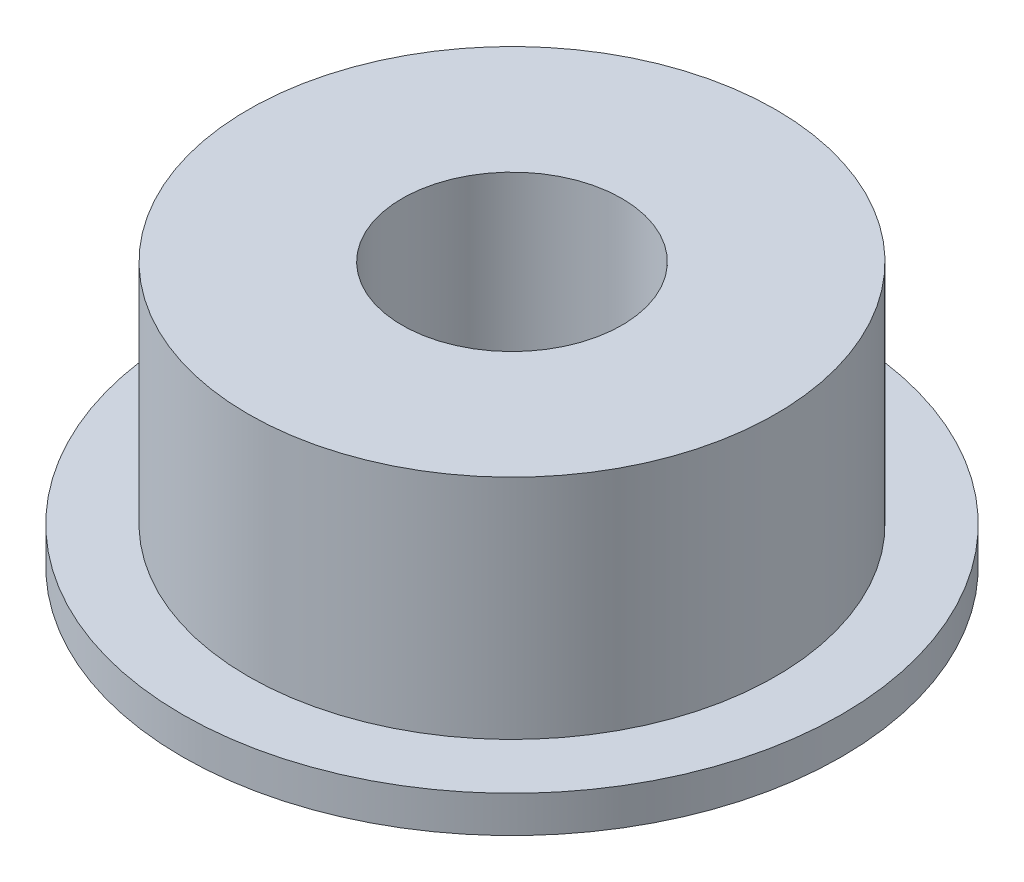
ISO-10303-21;
HEADER;
FILE_DESCRIPTION(('STEP AP214'),'2;1');
FILE_NAME('part.step','',(''),(''),'','','');
FILE_SCHEMA(('AUTOMOTIVE_DESIGN { 1 0 10303 214 1 1 1 1 }'));
ENDSEC;
DATA;
#1=APPLICATION_CONTEXT('core data for automotive mechanical design processes');
#2=APPLICATION_PROTOCOL_DEFINITION('international standard','automotive_design',2000,#1);
#3=PRODUCT_CONTEXT('',#1,'mechanical');
#4=PRODUCT('Part','Part','',(#3));
#5=PRODUCT_RELATED_PRODUCT_CATEGORY('part','',(#4));
#6=PRODUCT_DEFINITION_FORMATION('','',#4);
#7=PRODUCT_DEFINITION_CONTEXT('part definition',#1,'design');
#8=PRODUCT_DEFINITION('design','',#6,#7);
#9=PRODUCT_DEFINITION_SHAPE('','',#8);
#10=(LENGTH_UNIT() NAMED_UNIT(*) SI_UNIT(.MILLI.,.METRE.));
#11=(NAMED_UNIT(*) PLANE_ANGLE_UNIT() SI_UNIT($,.RADIAN.));
#12=(NAMED_UNIT(*) SI_UNIT($,.STERADIAN.) SOLID_ANGLE_UNIT());
#13=UNCERTAINTY_MEASURE_WITH_UNIT(LENGTH_MEASURE(1.E-05),#10,'distance_accuracy_value','');
#14=(GEOMETRIC_REPRESENTATION_CONTEXT(3) GLOBAL_UNCERTAINTY_ASSIGNED_CONTEXT((#13)) GLOBAL_UNIT_ASSIGNED_CONTEXT((#10,
#11,#12)) REPRESENTATION_CONTEXT('',''));
#15=CARTESIAN_POINT('',(0.,0.,0.));
#16=DIRECTION('',(0.,0.,1.));
#17=DIRECTION('',(1.,0.,0.));
#18=AXIS2_PLACEMENT_3D('',#15,#16,#17);
#19=CARTESIAN_POINT('',(0.,0.5,0.));
#20=DIRECTION('',(0.,-1.,0.));
#21=DIRECTION('',(0.,0.,-1.));
#22=AXIS2_PLACEMENT_3D('',#19,#20,#21);
#23=CYLINDRICAL_SURFACE('',#22,4.5);
#24=CARTESIAN_POINT('',(0.,0.5,0.));
#25=DIRECTION('',(0.,1.,0.));
#26=DIRECTION('',(0.,0.,1.));
#27=AXIS2_PLACEMENT_3D('',#24,#25,#26);
#28=CIRCLE('',#27,4.5);
#29=CARTESIAN_POINT('',(0.,0.5,4.5));
#30=VERTEX_POINT('',#29);
#31=EDGE_CURVE('E43',#30,#30,#28,.T.);
#32=ORIENTED_EDGE('',*,*,#31,.F.);
#33=EDGE_LOOP('',(#32));
#34=FACE_BOUND('',#33,.T.);
#35=CARTESIAN_POINT('',(0.,0.,0.));
#36=DIRECTION('',(0.,1.,0.));
#37=DIRECTION('',(0.,0.,1.));
#38=AXIS2_PLACEMENT_3D('',#35,#36,#37);
#39=CIRCLE('',#38,4.5);
#40=CARTESIAN_POINT('',(0.,0.,4.5));
#41=VERTEX_POINT('',#40);
#42=EDGE_CURVE('E39',#41,#41,#39,.T.);
#43=ORIENTED_EDGE('',*,*,#42,.T.);
#44=EDGE_LOOP('',(#43));
#45=FACE_BOUND('',#44,.T.);
#46=ADVANCED_FACE('F36',(#34,#45),#23,.T.);
#47=CARTESIAN_POINT('',(0.,0.5,0.));
#48=DIRECTION('',(0.,1.,0.));
#49=DIRECTION('',(0.,0.,1.));
#50=AXIS2_PLACEMENT_3D('',#47,#48,#49);
#51=PLANE('',#50);
#52=CARTESIAN_POINT('',(0.,0.5,0.));
#53=DIRECTION('',(0.,1.,0.));
#54=DIRECTION('',(0.,0.,1.));
#55=AXIS2_PLACEMENT_3D('',#52,#53,#54);
#56=CIRCLE('',#55,3.6);
#57=CARTESIAN_POINT('',(0.,0.5,-3.6));
#58=VERTEX_POINT('',#57);
#59=EDGE_CURVE('E10',#58,#58,#56,.T.);
#60=ORIENTED_EDGE('',*,*,#59,.F.);
#61=EDGE_LOOP('',(#60));
#62=FACE_BOUND('',#61,.T.);
#63=ORIENTED_EDGE('',*,*,#31,.T.);
#64=EDGE_LOOP('',(#63));
#65=FACE_BOUND('',#64,.T.);
#66=ADVANCED_FACE('F72',(#62,#65),#51,.T.);
#67=CARTESIAN_POINT('',(0.,0.,0.));
#68=DIRECTION('',(0.,1.,0.));
#69=DIRECTION('',(0.,0.,1.));
#70=AXIS2_PLACEMENT_3D('',#67,#68,#69);
#71=PLANE('',#70);
#72=CARTESIAN_POINT('',(0.,0.,0.));
#73=DIRECTION('',(0.,-1.,0.));
#74=DIRECTION('',(0.,0.,-1.));
#75=AXIS2_PLACEMENT_3D('',#72,#73,#74);
#76=CIRCLE('',#75,1.5);
#77=CARTESIAN_POINT('',(0.,0.,-1.5));
#78=VERTEX_POINT('',#77);
#79=EDGE_CURVE('E53',#78,#78,#76,.T.);
#80=ORIENTED_EDGE('',*,*,#79,.F.);
#81=EDGE_LOOP('',(#80));
#82=FACE_BOUND('',#81,.T.);
#83=ORIENTED_EDGE('',*,*,#42,.F.);
#84=EDGE_LOOP('',(#83));
#85=FACE_BOUND('',#84,.T.);
#86=ADVANCED_FACE('F68',(#82,#85),#71,.F.);
#87=CARTESIAN_POINT('',(0.,3.6,0.));
#88=DIRECTION('',(0.,-1.,0.));
#89=DIRECTION('',(0.,0.,-1.));
#90=AXIS2_PLACEMENT_3D('',#87,#88,#89);
#91=CYLINDRICAL_SURFACE('',#90,3.6);
#92=CARTESIAN_POINT('',(0.,3.6,0.));
#93=DIRECTION('',(0.,1.,0.));
#94=DIRECTION('',(0.,0.,1.));
#95=AXIS2_PLACEMENT_3D('',#92,#93,#94);
#96=CIRCLE('',#95,3.6);
#97=CARTESIAN_POINT('',(0.,3.6,-3.6));
#98=VERTEX_POINT('',#97);
#99=EDGE_CURVE('E49',#98,#98,#96,.T.);
#100=CARTESIAN_POINT('',(0.,3.6,-3.6));
#101=CARTESIAN_POINT('',(0.,3.56770833333333,-3.6));
#102=CARTESIAN_POINT('',(0.,3.53541666666667,-3.6));
#103=CARTESIAN_POINT('',(0.,3.47083333333333,-3.6));
#104=CARTESIAN_POINT('',(0.,3.43854166666667,-3.6));
#105=CARTESIAN_POINT('',(0.,3.37395833333333,-3.6));
#106=CARTESIAN_POINT('',(0.,3.34166666666667,-3.6));
#107=CARTESIAN_POINT('',(0.,3.27708333333333,-3.6));
#108=CARTESIAN_POINT('',(0.,3.24479166666667,-3.6));
#109=CARTESIAN_POINT('',(0.,3.18020833333333,-3.6));
#110=CARTESIAN_POINT('',(0.,3.14791666666667,-3.6));
#111=CARTESIAN_POINT('',(0.,3.08333333333333,-3.6));
#112=CARTESIAN_POINT('',(0.,3.05104166666667,-3.6));
#113=CARTESIAN_POINT('',(0.,2.98645833333333,-3.6));
#114=CARTESIAN_POINT('',(0.,2.95416666666667,-3.6));
#115=CARTESIAN_POINT('',(0.,2.88958333333333,-3.6));
#116=CARTESIAN_POINT('',(0.,2.85729166666667,-3.6));
#117=CARTESIAN_POINT('',(0.,2.79270833333333,-3.6));
#118=CARTESIAN_POINT('',(0.,2.76041666666667,-3.6));
#119=CARTESIAN_POINT('',(0.,2.69583333333333,-3.6));
#120=CARTESIAN_POINT('',(0.,2.66354166666667,-3.6));
#121=CARTESIAN_POINT('',(0.,2.59895833333333,-3.6));
#122=CARTESIAN_POINT('',(0.,2.56666666666667,-3.6));
#123=CARTESIAN_POINT('',(0.,2.50208333333333,-3.6));
#124=CARTESIAN_POINT('',(0.,2.46979166666667,-3.6));
#125=CARTESIAN_POINT('',(0.,2.40520833333333,-3.6));
#126=CARTESIAN_POINT('',(0.,2.37291666666667,-3.6));
#127=CARTESIAN_POINT('',(0.,2.30833333333333,-3.6));
#128=CARTESIAN_POINT('',(0.,2.27604166666667,-3.6));
#129=CARTESIAN_POINT('',(0.,2.21145833333333,-3.6));
#130=CARTESIAN_POINT('',(0.,2.17916666666667,-3.6));
#131=CARTESIAN_POINT('',(0.,2.11458333333333,-3.6));
#132=CARTESIAN_POINT('',(0.,2.08229166666667,-3.6));
#133=CARTESIAN_POINT('',(0.,2.01770833333333,-3.6));
#134=CARTESIAN_POINT('',(0.,1.98541666666667,-3.6));
#135=CARTESIAN_POINT('',(0.,1.92083333333333,-3.6));
#136=CARTESIAN_POINT('',(0.,1.88854166666667,-3.6));
#137=CARTESIAN_POINT('',(0.,1.82395833333333,-3.6));
#138=CARTESIAN_POINT('',(0.,1.79166666666667,-3.6));
#139=CARTESIAN_POINT('',(0.,1.72708333333333,-3.6));
#140=CARTESIAN_POINT('',(0.,1.69479166666667,-3.6));
#141=CARTESIAN_POINT('',(0.,1.63020833333333,-3.6));
#142=CARTESIAN_POINT('',(0.,1.59791666666667,-3.6));
#143=CARTESIAN_POINT('',(0.,1.53333333333333,-3.6));
#144=CARTESIAN_POINT('',(0.,1.50104166666667,-3.6));
#145=CARTESIAN_POINT('',(0.,1.43645833333333,-3.6));
#146=CARTESIAN_POINT('',(0.,1.40416666666667,-3.6));
#147=CARTESIAN_POINT('',(0.,1.33958333333333,-3.6));
#148=CARTESIAN_POINT('',(0.,1.30729166666667,-3.6));
#149=CARTESIAN_POINT('',(0.,1.24270833333333,-3.6));
#150=CARTESIAN_POINT('',(0.,1.21041666666667,-3.6));
#151=CARTESIAN_POINT('',(0.,1.14583333333333,-3.6));
#152=CARTESIAN_POINT('',(0.,1.11354166666667,-3.6));
#153=CARTESIAN_POINT('',(0.,1.04895833333333,-3.6));
#154=CARTESIAN_POINT('',(0.,1.01666666666667,-3.6));
#155=CARTESIAN_POINT('',(0.,0.952083333333333,-3.6));
#156=CARTESIAN_POINT('',(0.,0.919791666666667,-3.6));
#157=CARTESIAN_POINT('',(0.,0.855208333333333,-3.6));
#158=CARTESIAN_POINT('',(0.,0.822916666666667,-3.6));
#159=CARTESIAN_POINT('',(0.,0.758333333333333,-3.6));
#160=CARTESIAN_POINT('',(0.,0.726041666666667,-3.6));
#161=CARTESIAN_POINT('',(0.,0.661458333333333,-3.6));
#162=CARTESIAN_POINT('',(0.,0.629166666666667,-3.6));
#163=CARTESIAN_POINT('',(0.,0.564583333333334,-3.6));
#164=CARTESIAN_POINT('',(0.,0.532291666666667,-3.6));
#165=CARTESIAN_POINT('',(0.,0.5,-3.6));
#166=B_SPLINE_CURVE_WITH_KNOTS('',3,(#100,#101,#102,#103,#104,#105,#106,#107,#108,#109,#110,
#111,#112,#113,#114,#115,#116,#117,#118,#119,#120,#121,#122,#123,#124,#125,#126,#127,#128,#129,
#130,#131,#132,#133,#134,#135,#136,#137,#138,#139,#140,#141,#142,#143,#144,#145,#146,#147,#148,
#149,#150,#151,#152,#153,#154,#155,#156,#157,#158,#159,#160,#161,#162,#163,#164,#165),
.UNSPECIFIED.,.F.,.F.,(4,2,2,2,2,2,2,2,2,2,2,2,2,2,2,2,2,2,2,2,2,2,2,2,2,2,2,2,2,2,2,2,4),(0.,
0.0968749999999997,0.19375,0.290625,0.3875,0.484375,0.58125,0.678124999999999,0.775,0.871875,
0.96875,1.065625,1.1625,1.259375,1.35625,1.453125,1.55,1.646875,1.74375,1.840625,1.9375,
2.034375,2.13125,2.228125,2.325,2.421875,2.51875,2.615625,2.7125,2.809375,2.90625,3.003125,3.1),.UNSPECIFIED.);
#167=EDGE_CURVE('BSEAM71',#98,#58,#166,.T.);
#168=ORIENTED_EDGE('',*,*,#99,.F.);
#169=ORIENTED_EDGE('',*,*,#59,.T.);
#170=ORIENTED_EDGE('',*,*,#167,.T.);
#171=ORIENTED_EDGE('',*,*,#167,.F.);
#172=EDGE_LOOP('',(#168,#170,#169,#171));
#173=FACE_BOUND('',#172,.T.);
#174=ADVANCED_FACE('F71',(#173),#91,.T.);
#175=CARTESIAN_POINT('',(0.,3.6,0.));
#176=DIRECTION('',(0.,1.,0.));
#177=DIRECTION('',(0.,0.,1.));
#178=AXIS2_PLACEMENT_3D('',#175,#176,#177);
#179=PLANE('',#178);
#180=CARTESIAN_POINT('',(0.,3.6,0.));
#181=DIRECTION('',(0.,-1.,0.));
#182=DIRECTION('',(0.,0.,-1.));
#183=AXIS2_PLACEMENT_3D('',#180,#181,#182);
#184=CIRCLE('',#183,1.5);
#185=CARTESIAN_POINT('',(0.,3.6,-1.5));
#186=VERTEX_POINT('',#185);
#187=EDGE_CURVE('E52',#186,#186,#184,.T.);
#188=ORIENTED_EDGE('',*,*,#187,.T.);
#189=EDGE_LOOP('',(#188));
#190=FACE_BOUND('',#189,.T.);
#191=ORIENTED_EDGE('',*,*,#99,.T.);
#192=EDGE_LOOP('',(#191));
#193=FACE_BOUND('',#192,.T.);
#194=ADVANCED_FACE('F59',(#190,#193),#179,.T.);
#195=CARTESIAN_POINT('',(0.,3.6,0.));
#196=DIRECTION('',(0.,-1.,0.));
#197=DIRECTION('',(0.,0.,-1.));
#198=AXIS2_PLACEMENT_3D('',#195,#196,#197);
#199=CYLINDRICAL_SURFACE('',#198,1.5);
#200=ORIENTED_EDGE('',*,*,#187,.F.);
#201=EDGE_LOOP('',(#200));
#202=FACE_BOUND('',#201,.T.);
#203=ORIENTED_EDGE('',*,*,#79,.T.);
#204=EDGE_LOOP('',(#203));
#205=FACE_BOUND('',#204,.T.);
#206=ADVANCED_FACE('F62',(#202,#205),#199,.F.);
#207=CLOSED_SHELL('',(#46,#66,#86,#174,#194,#206));
#208=MANIFOLD_SOLID_BREP('B2',#207);
#209=ADVANCED_BREP_SHAPE_REPRESENTATION('',(#18,#208),#14);
#210=SHAPE_DEFINITION_REPRESENTATION(#9,#209);
ENDSEC;
END-ISO-10303-21;
